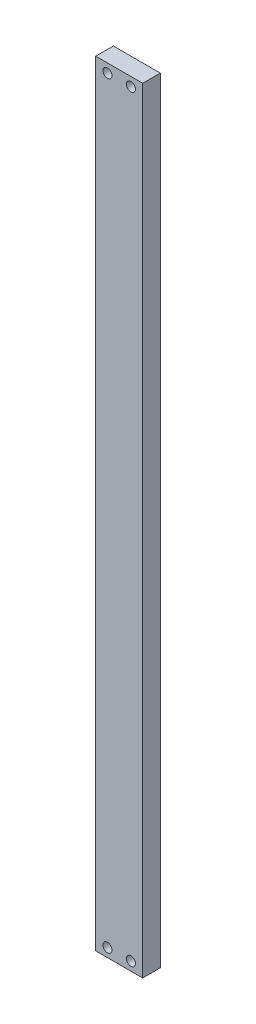
ISO-10303-21;
HEADER;
FILE_DESCRIPTION(('STEP AP214'),'2;1');
FILE_NAME('part.step','',(''),(''),'','','');
FILE_SCHEMA(('AUTOMOTIVE_DESIGN { 1 0 10303 214 1 1 1 1 }'));
ENDSEC;
DATA;
#1=APPLICATION_CONTEXT('core data for automotive mechanical design processes');
#2=APPLICATION_PROTOCOL_DEFINITION('international standard','automotive_design',2000,#1);
#3=PRODUCT_CONTEXT('',#1,'mechanical');
#4=PRODUCT('Part','Part','',(#3));
#5=PRODUCT_RELATED_PRODUCT_CATEGORY('part','',(#4));
#6=PRODUCT_DEFINITION_FORMATION('','',#4);
#7=PRODUCT_DEFINITION_CONTEXT('part definition',#1,'design');
#8=PRODUCT_DEFINITION('design','',#6,#7);
#9=PRODUCT_DEFINITION_SHAPE('','',#8);
#10=(LENGTH_UNIT() NAMED_UNIT(*) SI_UNIT(.MILLI.,.METRE.));
#11=(NAMED_UNIT(*) PLANE_ANGLE_UNIT() SI_UNIT($,.RADIAN.));
#12=(NAMED_UNIT(*) SI_UNIT($,.STERADIAN.) SOLID_ANGLE_UNIT());
#13=UNCERTAINTY_MEASURE_WITH_UNIT(LENGTH_MEASURE(1.E-05),#10,'distance_accuracy_value','');
#14=(GEOMETRIC_REPRESENTATION_CONTEXT(3) GLOBAL_UNCERTAINTY_ASSIGNED_CONTEXT((#13)) GLOBAL_UNIT_ASSIGNED_CONTEXT((#10,
#11,#12)) REPRESENTATION_CONTEXT('',''));
#15=CARTESIAN_POINT('',(0.,0.,0.));
#16=DIRECTION('',(0.,0.,1.));
#17=DIRECTION('',(1.,0.,0.));
#18=AXIS2_PLACEMENT_3D('',#15,#16,#17);
#19=CARTESIAN_POINT('',(-29.1923781698894,419.1,-9.525));
#20=DIRECTION('',(1.,0.,0.));
#21=DIRECTION('',(0.,0.,-1.));
#22=AXIS2_PLACEMENT_3D('',#19,#20,#21);
#23=PLANE('',#22);
#24=CARTESIAN_POINT('',(-29.1923781698894,393.7,-4.7625));
#25=DIRECTION('',(-1.,0.,0.));
#26=DIRECTION('',(0.,0.,1.));
#27=AXIS2_PLACEMENT_3D('',#24,#25,#26);
#28=CIRCLE('',#27,1.72719999999998);
#29=CARTESIAN_POINT('',(-29.1923781698894,393.7,-3.03530000000002));
#30=VERTEX_POINT('',#29);
#31=EDGE_CURVE('E114',#30,#30,#28,.T.);
#32=ORIENTED_EDGE('',*,*,#31,.F.);
#33=EDGE_LOOP('',(#32));
#34=FACE_BOUND('',#33,.T.);
#35=CARTESIAN_POINT('',(-29.1923781698894,320.04,-4.7625));
#36=DIRECTION('',(-1.,0.,0.));
#37=DIRECTION('',(0.,0.,1.));
#38=AXIS2_PLACEMENT_3D('',#35,#36,#37);
#39=CIRCLE('',#38,1.72719999999998);
#40=CARTESIAN_POINT('',(-29.1923781698894,320.04,-3.03530000000002));
#41=VERTEX_POINT('',#40);
#42=EDGE_CURVE('E113',#41,#41,#39,.T.);
#43=ORIENTED_EDGE('',*,*,#42,.F.);
#44=EDGE_LOOP('',(#43));
#45=FACE_BOUND('',#44,.T.);
#46=CARTESIAN_POINT('',(-29.1923781698894,246.38,-4.7625));
#47=DIRECTION('',(-1.,0.,0.));
#48=DIRECTION('',(0.,0.,1.));
#49=AXIS2_PLACEMENT_3D('',#46,#47,#48);
#50=CIRCLE('',#49,1.72719999999998);
#51=CARTESIAN_POINT('',(-29.1923781698894,246.38,-3.03530000000002));
#52=VERTEX_POINT('',#51);
#53=EDGE_CURVE('E124',#52,#52,#50,.T.);
#54=ORIENTED_EDGE('',*,*,#53,.F.);
#55=EDGE_LOOP('',(#54));
#56=FACE_BOUND('',#55,.T.);
#57=CARTESIAN_POINT('',(-29.1923781698894,172.72,-4.7625));
#58=DIRECTION('',(-1.,0.,0.));
#59=DIRECTION('',(0.,0.,1.));
#60=AXIS2_PLACEMENT_3D('',#57,#58,#59);
#61=CIRCLE('',#60,1.72719999999998);
#62=CARTESIAN_POINT('',(-29.1923781698894,172.72,-3.03530000000002));
#63=VERTEX_POINT('',#62);
#64=EDGE_CURVE('E130',#63,#63,#61,.T.);
#65=ORIENTED_EDGE('',*,*,#64,.F.);
#66=EDGE_LOOP('',(#65));
#67=FACE_BOUND('',#66,.T.);
#68=CARTESIAN_POINT('',(-29.1923781698894,99.06,-4.7625));
#69=DIRECTION('',(-1.,0.,0.));
#70=DIRECTION('',(0.,0.,1.));
#71=AXIS2_PLACEMENT_3D('',#68,#69,#70);
#72=CIRCLE('',#71,1.7272);
#73=CARTESIAN_POINT('',(-29.1923781698894,99.06,-3.0353));
#74=VERTEX_POINT('',#73);
#75=EDGE_CURVE('E136',#74,#74,#72,.T.);
#76=ORIENTED_EDGE('',*,*,#75,.F.);
#77=EDGE_LOOP('',(#76));
#78=FACE_BOUND('',#77,.T.);
#79=CARTESIAN_POINT('',(-29.1923781698894,25.4,-4.7625));
#80=DIRECTION('',(-1.,0.,0.));
#81=DIRECTION('',(0.,0.,1.));
#82=AXIS2_PLACEMENT_3D('',#79,#80,#81);
#83=CIRCLE('',#82,1.7272);
#84=CARTESIAN_POINT('',(-29.1923781698894,25.4,-3.0353));
#85=VERTEX_POINT('',#84);
#86=EDGE_CURVE('E142',#85,#85,#83,.T.);
#87=ORIENTED_EDGE('',*,*,#86,.F.);
#88=EDGE_LOOP('',(#87));
#89=FACE_BOUND('',#88,.T.);
#90=DIRECTION('',(0.,0.,1.));
#91=VECTOR('',#90,1.);
#92=CARTESIAN_POINT('',(-29.1923781698894,0.,-9.525));
#93=LINE('',#92,#91);
#94=CARTESIAN_POINT('',(-29.1923781698894,0.,-9.525));
#95=VERTEX_POINT('',#94);
#96=CARTESIAN_POINT('',(-29.1923781698894,0.,0.));
#97=VERTEX_POINT('',#96);
#98=EDGE_CURVE('E196',#95,#97,#93,.T.);
#99=ORIENTED_EDGE('',*,*,#98,.T.);
#100=DIRECTION('',(0.,-1.,0.));
#101=VECTOR('',#100,1.);
#102=CARTESIAN_POINT('',(-29.1923781698894,419.1,0.));
#103=LINE('',#102,#101);
#104=CARTESIAN_POINT('',(-29.1923781698894,419.1,0.));
#105=VERTEX_POINT('',#104);
#106=EDGE_CURVE('E11',#105,#97,#103,.T.);
#107=ORIENTED_EDGE('',*,*,#106,.F.);
#108=DIRECTION('',(0.,0.,1.));
#109=VECTOR('',#108,1.);
#110=CARTESIAN_POINT('',(-29.1923781698894,419.1,-9.525));
#111=LINE('',#110,#109);
#112=CARTESIAN_POINT('',(-29.1923781698894,419.1,-9.525));
#113=VERTEX_POINT('',#112);
#114=EDGE_CURVE('E197',#113,#105,#111,.T.);
#115=ORIENTED_EDGE('',*,*,#114,.F.);
#116=DIRECTION('',(0.,-1.,0.));
#117=VECTOR('',#116,1.);
#118=CARTESIAN_POINT('',(-29.1923781698894,419.1,-9.525));
#119=LINE('',#118,#117);
#120=EDGE_CURVE('E203',#113,#95,#119,.T.);
#121=ORIENTED_EDGE('',*,*,#120,.T.);
#122=EDGE_LOOP('',(#99,#107,#115,#121));
#123=FACE_BOUND('',#122,.T.);
#124=ADVANCED_FACE('F37',(#34,#45,#56,#67,#78,#89,#123),#23,.F.);
#125=CARTESIAN_POINT('',(-29.1923781698894,419.1,0.));
#126=DIRECTION('',(0.,0.,-1.));
#127=DIRECTION('',(-1.,0.,0.));
#128=AXIS2_PLACEMENT_3D('',#125,#126,#127);
#129=PLANE('',#128);
#130=CARTESIAN_POINT('',(-10.1423781698894,414.3375,0.));
#131=DIRECTION('',(0.,0.,-1.));
#132=DIRECTION('',(-1.,0.,0.));
#133=AXIS2_PLACEMENT_3D('',#130,#131,#132);
#134=CIRCLE('',#133,2.45745);
#135=CARTESIAN_POINT('',(-12.5998281698894,414.3375,0.));
#136=VERTEX_POINT('',#135);
#137=EDGE_CURVE('E157',#136,#136,#134,.T.);
#138=ORIENTED_EDGE('',*,*,#137,.T.);
#139=EDGE_LOOP('',(#138));
#140=FACE_BOUND('',#139,.T.);
#141=CARTESIAN_POINT('',(-22.8423781698894,414.3375,0.));
#142=DIRECTION('',(0.,0.,-1.));
#143=DIRECTION('',(-1.,0.,0.));
#144=AXIS2_PLACEMENT_3D('',#141,#142,#143);
#145=CIRCLE('',#144,2.45745);
#146=CARTESIAN_POINT('',(-25.2998281698894,414.3375,0.));
#147=VERTEX_POINT('',#146);
#148=EDGE_CURVE('E169',#147,#147,#145,.T.);
#149=ORIENTED_EDGE('',*,*,#148,.T.);
#150=EDGE_LOOP('',(#149));
#151=FACE_BOUND('',#150,.T.);
#152=CARTESIAN_POINT('',(-10.1423781698894,4.7625,0.));
#153=DIRECTION('',(0.,0.,-1.));
#154=DIRECTION('',(-1.,0.,0.));
#155=AXIS2_PLACEMENT_3D('',#152,#153,#154);
#156=CIRCLE('',#155,2.45745);
#157=CARTESIAN_POINT('',(-12.5998281698894,4.7625,0.));
#158=VERTEX_POINT('',#157);
#159=EDGE_CURVE('E181',#158,#158,#156,.T.);
#160=ORIENTED_EDGE('',*,*,#159,.T.);
#161=EDGE_LOOP('',(#160));
#162=FACE_BOUND('',#161,.T.);
#163=CARTESIAN_POINT('',(-22.8423781698894,4.7625,0.));
#164=DIRECTION('',(0.,0.,-1.));
#165=DIRECTION('',(-1.,0.,0.));
#166=AXIS2_PLACEMENT_3D('',#163,#164,#165);
#167=CIRCLE('',#166,2.45745);
#168=CARTESIAN_POINT('',(-25.2998281698894,4.7625,0.));
#169=VERTEX_POINT('',#168);
#170=EDGE_CURVE('E193',#169,#169,#167,.T.);
#171=ORIENTED_EDGE('',*,*,#170,.T.);
#172=EDGE_LOOP('',(#171));
#173=FACE_BOUND('',#172,.T.);
#174=DIRECTION('',(1.,0.,0.));
#175=VECTOR('',#174,1.);
#176=CARTESIAN_POINT('',(-29.1923781698894,0.,0.));
#177=LINE('',#176,#175);
#178=CARTESIAN_POINT('',(-3.7923781698894,0.,0.));
#179=VERTEX_POINT('',#178);
#180=EDGE_CURVE('E206',#97,#179,#177,.T.);
#181=ORIENTED_EDGE('',*,*,#180,.T.);
#182=DIRECTION('',(0.,-1.,0.));
#183=VECTOR('',#182,1.);
#184=CARTESIAN_POINT('',(-3.7923781698894,419.1,0.));
#185=LINE('',#184,#183);
#186=CARTESIAN_POINT('',(-3.7923781698894,419.1,0.));
#187=VERTEX_POINT('',#186);
#188=EDGE_CURVE('E45',#187,#179,#185,.T.);
#189=ORIENTED_EDGE('',*,*,#188,.F.);
#190=DIRECTION('',(1.,0.,0.));
#191=VECTOR('',#190,1.);
#192=CARTESIAN_POINT('',(-29.1923781698894,419.1,0.));
#193=LINE('',#192,#191);
#194=EDGE_CURVE('E84',#105,#187,#193,.T.);
#195=ORIENTED_EDGE('',*,*,#194,.F.);
#196=ORIENTED_EDGE('',*,*,#106,.T.);
#197=EDGE_LOOP('',(#181,#189,#195,#196));
#198=FACE_BOUND('',#197,.T.);
#199=ADVANCED_FACE('F230',(#140,#151,#162,#173,#198),#129,.F.);
#200=CARTESIAN_POINT('',(-3.7923781698894,419.1,-9.525));
#201=DIRECTION('',(-1.,0.,0.));
#202=DIRECTION('',(0.,0.,1.));
#203=AXIS2_PLACEMENT_3D('',#200,#201,#202);
#204=PLANE('',#203);
#205=DIRECTION('',(0.,0.,-1.));
#206=VECTOR('',#205,1.);
#207=CARTESIAN_POINT('',(-3.7923781698894,0.,-9.525));
#208=LINE('',#207,#206);
#209=CARTESIAN_POINT('',(-3.7923781698894,0.,-9.525));
#210=VERTEX_POINT('',#209);
#211=EDGE_CURVE('E71',#179,#210,#208,.T.);
#212=ORIENTED_EDGE('',*,*,#211,.T.);
#213=DIRECTION('',(0.,-1.,0.));
#214=VECTOR('',#213,1.);
#215=CARTESIAN_POINT('',(-3.7923781698894,419.1,-9.525));
#216=LINE('',#215,#214);
#217=CARTESIAN_POINT('',(-3.7923781698894,419.1,-9.525));
#218=VERTEX_POINT('',#217);
#219=EDGE_CURVE('E211',#218,#210,#216,.T.);
#220=ORIENTED_EDGE('',*,*,#219,.F.);
#221=DIRECTION('',(0.,0.,-1.));
#222=VECTOR('',#221,1.);
#223=CARTESIAN_POINT('',(-3.7923781698894,419.1,-9.525));
#224=LINE('',#223,#222);
#225=EDGE_CURVE('E200',#187,#218,#224,.T.);
#226=ORIENTED_EDGE('',*,*,#225,.F.);
#227=ORIENTED_EDGE('',*,*,#188,.T.);
#228=EDGE_LOOP('',(#212,#220,#226,#227));
#229=FACE_BOUND('',#228,.T.);
#230=ADVANCED_FACE('F213',(#229),#204,.F.);
#231=CARTESIAN_POINT('',(-29.1923781698894,419.1,-9.525));
#232=DIRECTION('',(0.,0.,1.));
#233=DIRECTION('',(1.,0.,0.));
#234=AXIS2_PLACEMENT_3D('',#231,#232,#233);
#235=PLANE('',#234);
#236=CARTESIAN_POINT('',(-10.1423781698894,414.3375,-9.525));
#237=DIRECTION('',(0.,0.,-1.));
#238=DIRECTION('',(-1.,0.,0.));
#239=AXIS2_PLACEMENT_3D('',#236,#237,#238);
#240=CIRCLE('',#239,3.96875);
#241=CARTESIAN_POINT('',(-14.1111281698894,414.3375,-9.525));
#242=VERTEX_POINT('',#241);
#243=EDGE_CURVE('E148',#242,#242,#240,.T.);
#244=ORIENTED_EDGE('',*,*,#243,.F.);
#245=EDGE_LOOP('',(#244));
#246=FACE_BOUND('',#245,.T.);
#247=CARTESIAN_POINT('',(-22.8423781698894,414.3375,-9.525));
#248=DIRECTION('',(0.,0.,-1.));
#249=DIRECTION('',(-1.,0.,0.));
#250=AXIS2_PLACEMENT_3D('',#247,#248,#249);
#251=CIRCLE('',#250,3.96875);
#252=CARTESIAN_POINT('',(-26.8111281698894,414.3375,-9.525));
#253=VERTEX_POINT('',#252);
#254=EDGE_CURVE('E160',#253,#253,#251,.T.);
#255=ORIENTED_EDGE('',*,*,#254,.F.);
#256=EDGE_LOOP('',(#255));
#257=FACE_BOUND('',#256,.T.);
#258=CARTESIAN_POINT('',(-10.1423781698894,4.7625,-9.525));
#259=DIRECTION('',(0.,0.,-1.));
#260=DIRECTION('',(-1.,0.,0.));
#261=AXIS2_PLACEMENT_3D('',#258,#259,#260);
#262=CIRCLE('',#261,3.96875);
#263=CARTESIAN_POINT('',(-14.1111281698894,4.7625,-9.525));
#264=VERTEX_POINT('',#263);
#265=EDGE_CURVE('E172',#264,#264,#262,.T.);
#266=ORIENTED_EDGE('',*,*,#265,.F.);
#267=EDGE_LOOP('',(#266));
#268=FACE_BOUND('',#267,.T.);
#269=CARTESIAN_POINT('',(-22.8423781698894,4.7625,-9.525));
#270=DIRECTION('',(0.,0.,-1.));
#271=DIRECTION('',(-1.,0.,0.));
#272=AXIS2_PLACEMENT_3D('',#269,#270,#271);
#273=CIRCLE('',#272,3.96875);
#274=CARTESIAN_POINT('',(-26.8111281698894,4.7625,-9.525));
#275=VERTEX_POINT('',#274);
#276=EDGE_CURVE('E184',#275,#275,#273,.T.);
#277=ORIENTED_EDGE('',*,*,#276,.F.);
#278=EDGE_LOOP('',(#277));
#279=FACE_BOUND('',#278,.T.);
#280=DIRECTION('',(-1.,0.,0.));
#281=VECTOR('',#280,1.);
#282=CARTESIAN_POINT('',(-29.1923781698894,0.,-9.525));
#283=LINE('',#282,#281);
#284=EDGE_CURVE('E77',#210,#95,#283,.T.);
#285=ORIENTED_EDGE('',*,*,#284,.T.);
#286=ORIENTED_EDGE('',*,*,#120,.F.);
#287=DIRECTION('',(-1.,0.,0.));
#288=VECTOR('',#287,1.);
#289=CARTESIAN_POINT('',(-29.1923781698894,419.1,-9.525));
#290=LINE('',#289,#288);
#291=EDGE_CURVE('E53',#218,#113,#290,.T.);
#292=ORIENTED_EDGE('',*,*,#291,.F.);
#293=ORIENTED_EDGE('',*,*,#219,.T.);
#294=EDGE_LOOP('',(#285,#286,#292,#293));
#295=FACE_BOUND('',#294,.T.);
#296=ADVANCED_FACE('F220',(#246,#257,#268,#279,#295),#235,.F.);
#297=CARTESIAN_POINT('',(0.,419.1,0.));
#298=DIRECTION('',(0.,1.,0.));
#299=DIRECTION('',(0.,0.,1.));
#300=AXIS2_PLACEMENT_3D('',#297,#298,#299);
#301=PLANE('',#300);
#302=ORIENTED_EDGE('',*,*,#114,.T.);
#303=ORIENTED_EDGE('',*,*,#194,.T.);
#304=ORIENTED_EDGE('',*,*,#225,.T.);
#305=ORIENTED_EDGE('',*,*,#291,.T.);
#306=EDGE_LOOP('',(#302,#303,#304,#305));
#307=FACE_BOUND('',#306,.T.);
#308=ADVANCED_FACE('F222',(#307),#301,.T.);
#309=CARTESIAN_POINT('',(0.,0.,0.));
#310=DIRECTION('',(0.,1.,0.));
#311=DIRECTION('',(0.,0.,1.));
#312=AXIS2_PLACEMENT_3D('',#309,#310,#311);
#313=PLANE('',#312);
#314=ORIENTED_EDGE('',*,*,#98,.F.);
#315=ORIENTED_EDGE('',*,*,#284,.F.);
#316=ORIENTED_EDGE('',*,*,#211,.F.);
#317=ORIENTED_EDGE('',*,*,#180,.F.);
#318=EDGE_LOOP('',(#314,#315,#316,#317));
#319=FACE_BOUND('',#318,.T.);
#320=ADVANCED_FACE('F216',(#319),#313,.F.);
#321=CARTESIAN_POINT('',(-22.8423781698894,4.7625,-9.525));
#322=DIRECTION('',(0.,0.,-1.));
#323=DIRECTION('',(-1.,0.,0.));
#324=AXIS2_PLACEMENT_3D('',#321,#322,#323);
#325=CYLINDRICAL_SURFACE('',#324,2.45745000000001);
#326=ORIENTED_EDGE('',*,*,#170,.F.);
#327=EDGE_LOOP('',(#326));
#328=FACE_BOUND('',#327,.T.);
#329=CARTESIAN_POINT('',(-22.8423781698894,4.7625,-5.3594));
#330=DIRECTION('',(0.,0.,-1.));
#331=DIRECTION('',(-1.,0.,0.));
#332=AXIS2_PLACEMENT_3D('',#329,#330,#331);
#333=CIRCLE('',#332,2.45745000000001);
#334=CARTESIAN_POINT('',(-25.2998281698894,4.7625,-5.3594));
#335=VERTEX_POINT('',#334);
#336=EDGE_CURVE('E190',#335,#335,#333,.T.);
#337=ORIENTED_EDGE('',*,*,#336,.T.);
#338=EDGE_LOOP('',(#337));
#339=FACE_BOUND('',#338,.T.);
#340=ADVANCED_FACE('F314',(#328,#339),#325,.F.);
#341=CARTESIAN_POINT('',(-20.3849281698894,4.7625,-5.3594));
#342=DIRECTION('',(0.,0.,1.));
#343=DIRECTION('',(1.,0.,0.));
#344=AXIS2_PLACEMENT_3D('',#341,#342,#343);
#345=PLANE('',#344);
#346=ORIENTED_EDGE('',*,*,#336,.F.);
#347=EDGE_LOOP('',(#346));
#348=FACE_BOUND('',#347,.T.);
#349=CARTESIAN_POINT('',(-22.8423781698894,4.7625,-5.3594));
#350=DIRECTION('',(0.,0.,-1.));
#351=DIRECTION('',(-1.,0.,0.));
#352=AXIS2_PLACEMENT_3D('',#349,#350,#351);
#353=CIRCLE('',#352,3.96875);
#354=CARTESIAN_POINT('',(-26.8111281698894,4.7625,-5.3594));
#355=VERTEX_POINT('',#354);
#356=EDGE_CURVE('E187',#355,#355,#353,.T.);
#357=ORIENTED_EDGE('',*,*,#356,.T.);
#358=EDGE_LOOP('',(#357));
#359=FACE_BOUND('',#358,.T.);
#360=ADVANCED_FACE('F310',(#348,#359),#345,.F.);
#361=CARTESIAN_POINT('',(-22.8423781698894,4.7625,-9.525));
#362=DIRECTION('',(0.,0.,-1.));
#363=DIRECTION('',(-1.,0.,0.));
#364=AXIS2_PLACEMENT_3D('',#361,#362,#363);
#365=CYLINDRICAL_SURFACE('',#364,3.96875);
#366=ORIENTED_EDGE('',*,*,#356,.F.);
#367=EDGE_LOOP('',(#366));
#368=FACE_BOUND('',#367,.T.);
#369=ORIENTED_EDGE('',*,*,#276,.T.);
#370=EDGE_LOOP('',(#369));
#371=FACE_BOUND('',#370,.T.);
#372=ADVANCED_FACE('F306',(#368,#371),#365,.F.);
#373=CARTESIAN_POINT('',(-10.1423781698894,4.7625,-9.525));
#374=DIRECTION('',(0.,0.,-1.));
#375=DIRECTION('',(-1.,0.,0.));
#376=AXIS2_PLACEMENT_3D('',#373,#374,#375);
#377=CYLINDRICAL_SURFACE('',#376,2.45745000000001);
#378=ORIENTED_EDGE('',*,*,#159,.F.);
#379=EDGE_LOOP('',(#378));
#380=FACE_BOUND('',#379,.T.);
#381=CARTESIAN_POINT('',(-10.1423781698894,4.7625,-5.3594));
#382=DIRECTION('',(0.,0.,-1.));
#383=DIRECTION('',(-1.,0.,0.));
#384=AXIS2_PLACEMENT_3D('',#381,#382,#383);
#385=CIRCLE('',#384,2.45745000000001);
#386=CARTESIAN_POINT('',(-12.5998281698894,4.7625,-5.3594));
#387=VERTEX_POINT('',#386);
#388=EDGE_CURVE('E178',#387,#387,#385,.T.);
#389=ORIENTED_EDGE('',*,*,#388,.T.);
#390=EDGE_LOOP('',(#389));
#391=FACE_BOUND('',#390,.T.);
#392=ADVANCED_FACE('F302',(#380,#391),#377,.F.);
#393=CARTESIAN_POINT('',(-7.68492816988939,4.7625,-5.3594));
#394=DIRECTION('',(0.,0.,1.));
#395=DIRECTION('',(1.,0.,0.));
#396=AXIS2_PLACEMENT_3D('',#393,#394,#395);
#397=PLANE('',#396);
#398=ORIENTED_EDGE('',*,*,#388,.F.);
#399=EDGE_LOOP('',(#398));
#400=FACE_BOUND('',#399,.T.);
#401=CARTESIAN_POINT('',(-10.1423781698894,4.7625,-5.3594));
#402=DIRECTION('',(0.,0.,-1.));
#403=DIRECTION('',(-1.,0.,0.));
#404=AXIS2_PLACEMENT_3D('',#401,#402,#403);
#405=CIRCLE('',#404,3.96875);
#406=CARTESIAN_POINT('',(-14.1111281698894,4.7625,-5.3594));
#407=VERTEX_POINT('',#406);
#408=EDGE_CURVE('E175',#407,#407,#405,.T.);
#409=ORIENTED_EDGE('',*,*,#408,.T.);
#410=EDGE_LOOP('',(#409));
#411=FACE_BOUND('',#410,.T.);
#412=ADVANCED_FACE('F298',(#400,#411),#397,.F.);
#413=CARTESIAN_POINT('',(-10.1423781698894,4.7625,-9.525));
#414=DIRECTION('',(0.,0.,-1.));
#415=DIRECTION('',(-1.,0.,0.));
#416=AXIS2_PLACEMENT_3D('',#413,#414,#415);
#417=CYLINDRICAL_SURFACE('',#416,3.96875);
#418=ORIENTED_EDGE('',*,*,#408,.F.);
#419=EDGE_LOOP('',(#418));
#420=FACE_BOUND('',#419,.T.);
#421=ORIENTED_EDGE('',*,*,#265,.T.);
#422=EDGE_LOOP('',(#421));
#423=FACE_BOUND('',#422,.T.);
#424=ADVANCED_FACE('F294',(#420,#423),#417,.F.);
#425=CARTESIAN_POINT('',(-22.8423781698894,414.3375,-9.525));
#426=DIRECTION('',(0.,0.,-1.));
#427=DIRECTION('',(-1.,0.,0.));
#428=AXIS2_PLACEMENT_3D('',#425,#426,#427);
#429=CYLINDRICAL_SURFACE('',#428,2.45745000000001);
#430=ORIENTED_EDGE('',*,*,#148,.F.);
#431=EDGE_LOOP('',(#430));
#432=FACE_BOUND('',#431,.T.);
#433=CARTESIAN_POINT('',(-22.8423781698894,414.3375,-5.3594));
#434=DIRECTION('',(0.,0.,-1.));
#435=DIRECTION('',(-1.,0.,0.));
#436=AXIS2_PLACEMENT_3D('',#433,#434,#435);
#437=CIRCLE('',#436,2.45745000000001);
#438=CARTESIAN_POINT('',(-25.2998281698894,414.3375,-5.3594));
#439=VERTEX_POINT('',#438);
#440=EDGE_CURVE('E166',#439,#439,#437,.T.);
#441=ORIENTED_EDGE('',*,*,#440,.T.);
#442=EDGE_LOOP('',(#441));
#443=FACE_BOUND('',#442,.T.);
#444=ADVANCED_FACE('F290',(#432,#443),#429,.F.);
#445=CARTESIAN_POINT('',(-20.3849281698894,414.3375,-5.3594));
#446=DIRECTION('',(0.,0.,1.));
#447=DIRECTION('',(1.,0.,0.));
#448=AXIS2_PLACEMENT_3D('',#445,#446,#447);
#449=PLANE('',#448);
#450=ORIENTED_EDGE('',*,*,#440,.F.);
#451=EDGE_LOOP('',(#450));
#452=FACE_BOUND('',#451,.T.);
#453=CARTESIAN_POINT('',(-22.8423781698894,414.3375,-5.3594));
#454=DIRECTION('',(0.,0.,-1.));
#455=DIRECTION('',(-1.,0.,0.));
#456=AXIS2_PLACEMENT_3D('',#453,#454,#455);
#457=CIRCLE('',#456,3.96875);
#458=CARTESIAN_POINT('',(-26.8111281698894,414.3375,-5.3594));
#459=VERTEX_POINT('',#458);
#460=EDGE_CURVE('E163',#459,#459,#457,.T.);
#461=ORIENTED_EDGE('',*,*,#460,.T.);
#462=EDGE_LOOP('',(#461));
#463=FACE_BOUND('',#462,.T.);
#464=ADVANCED_FACE('F286',(#452,#463),#449,.F.);
#465=CARTESIAN_POINT('',(-22.8423781698894,414.3375,-9.525));
#466=DIRECTION('',(0.,0.,-1.));
#467=DIRECTION('',(-1.,0.,0.));
#468=AXIS2_PLACEMENT_3D('',#465,#466,#467);
#469=CYLINDRICAL_SURFACE('',#468,3.96875);
#470=ORIENTED_EDGE('',*,*,#460,.F.);
#471=EDGE_LOOP('',(#470));
#472=FACE_BOUND('',#471,.T.);
#473=ORIENTED_EDGE('',*,*,#254,.T.);
#474=EDGE_LOOP('',(#473));
#475=FACE_BOUND('',#474,.T.);
#476=ADVANCED_FACE('F282',(#472,#475),#469,.F.);
#477=CARTESIAN_POINT('',(-10.1423781698894,414.3375,-9.525));
#478=DIRECTION('',(0.,0.,-1.));
#479=DIRECTION('',(-1.,0.,0.));
#480=AXIS2_PLACEMENT_3D('',#477,#478,#479);
#481=CYLINDRICAL_SURFACE('',#480,2.45745000000001);
#482=ORIENTED_EDGE('',*,*,#137,.F.);
#483=EDGE_LOOP('',(#482));
#484=FACE_BOUND('',#483,.T.);
#485=CARTESIAN_POINT('',(-10.1423781698894,414.3375,-5.3594));
#486=DIRECTION('',(0.,0.,-1.));
#487=DIRECTION('',(-1.,0.,0.));
#488=AXIS2_PLACEMENT_3D('',#485,#486,#487);
#489=CIRCLE('',#488,2.45745000000001);
#490=CARTESIAN_POINT('',(-12.5998281698894,414.3375,-5.3594));
#491=VERTEX_POINT('',#490);
#492=EDGE_CURVE('E154',#491,#491,#489,.T.);
#493=ORIENTED_EDGE('',*,*,#492,.T.);
#494=EDGE_LOOP('',(#493));
#495=FACE_BOUND('',#494,.T.);
#496=ADVANCED_FACE('F278',(#484,#495),#481,.F.);
#497=CARTESIAN_POINT('',(-7.68492816988939,414.3375,-5.3594));
#498=DIRECTION('',(0.,0.,1.));
#499=DIRECTION('',(1.,0.,0.));
#500=AXIS2_PLACEMENT_3D('',#497,#498,#499);
#501=PLANE('',#500);
#502=ORIENTED_EDGE('',*,*,#492,.F.);
#503=EDGE_LOOP('',(#502));
#504=FACE_BOUND('',#503,.T.);
#505=CARTESIAN_POINT('',(-10.1423781698894,414.3375,-5.3594));
#506=DIRECTION('',(0.,0.,-1.));
#507=DIRECTION('',(-1.,0.,0.));
#508=AXIS2_PLACEMENT_3D('',#505,#506,#507);
#509=CIRCLE('',#508,3.96875);
#510=CARTESIAN_POINT('',(-14.1111281698894,414.3375,-5.3594));
#511=VERTEX_POINT('',#510);
#512=EDGE_CURVE('E151',#511,#511,#509,.T.);
#513=ORIENTED_EDGE('',*,*,#512,.T.);
#514=EDGE_LOOP('',(#513));
#515=FACE_BOUND('',#514,.T.);
#516=ADVANCED_FACE('F274',(#504,#515),#501,.F.);
#517=CARTESIAN_POINT('',(-10.1423781698894,414.3375,-9.525));
#518=DIRECTION('',(0.,0.,-1.));
#519=DIRECTION('',(-1.,0.,0.));
#520=AXIS2_PLACEMENT_3D('',#517,#518,#519);
#521=CYLINDRICAL_SURFACE('',#520,3.96875);
#522=ORIENTED_EDGE('',*,*,#512,.F.);
#523=EDGE_LOOP('',(#522));
#524=FACE_BOUND('',#523,.T.);
#525=ORIENTED_EDGE('',*,*,#243,.T.);
#526=EDGE_LOOP('',(#525));
#527=FACE_BOUND('',#526,.T.);
#528=ADVANCED_FACE('F266',(#524,#527),#521,.F.);
#529=CARTESIAN_POINT('',(-13.1903781698894,25.4,-4.7625));
#530=DIRECTION('',(-1.,0.,0.));
#531=DIRECTION('',(0.,0.,1.));
#532=AXIS2_PLACEMENT_3D('',#529,#530,#531);
#533=CONICAL_SURFACE('',#532,1.72719999999999,1.02974425867665);
#534=CARTESIAN_POINT('',(-12.152571708705,25.4,-4.7625));
#535=VERTEX_POINT('',#534);
#536=VERTEX_LOOP('',#535);
#537=FACE_BOUND('',#536,.T.);
#538=CARTESIAN_POINT('',(-13.1903781698894,25.4,-4.7625));
#539=DIRECTION('',(-1.,0.,0.));
#540=DIRECTION('',(0.,0.,1.));
#541=AXIS2_PLACEMENT_3D('',#538,#539,#540);
#542=CIRCLE('',#541,1.72719999999999);
#543=CARTESIAN_POINT('',(-13.1903781698894,25.4,-3.03530000000001));
#544=VERTEX_POINT('',#543);
#545=EDGE_CURVE('E145',#544,#544,#542,.T.);
#546=ORIENTED_EDGE('',*,*,#545,.T.);
#547=EDGE_LOOP('',(#546));
#548=FACE_BOUND('',#547,.T.);
#549=ADVANCED_FACE('F256',(#537,#548),#533,.F.);
#550=CARTESIAN_POINT('',(-29.1923781698894,25.4,-4.7625));
#551=DIRECTION('',(-1.,0.,0.));
#552=DIRECTION('',(0.,0.,1.));
#553=AXIS2_PLACEMENT_3D('',#550,#551,#552);
#554=CYLINDRICAL_SURFACE('',#553,1.7272);
#555=ORIENTED_EDGE('',*,*,#545,.F.);
#556=EDGE_LOOP('',(#555));
#557=FACE_BOUND('',#556,.T.);
#558=ORIENTED_EDGE('',*,*,#86,.T.);
#559=EDGE_LOOP('',(#558));
#560=FACE_BOUND('',#559,.T.);
#561=ADVANCED_FACE('F253',(#557,#560),#554,.F.);
#562=CARTESIAN_POINT('',(-13.1903781698894,99.06,-4.7625));
#563=DIRECTION('',(-1.,0.,0.));
#564=DIRECTION('',(0.,0.,1.));
#565=AXIS2_PLACEMENT_3D('',#562,#563,#564);
#566=CONICAL_SURFACE('',#565,1.7272,1.02974425867665);
#567=CARTESIAN_POINT('',(-12.152571708705,99.06,-4.7625));
#568=VERTEX_POINT('',#567);
#569=VERTEX_LOOP('',#568);
#570=FACE_BOUND('',#569,.T.);
#571=CARTESIAN_POINT('',(-13.1903781698894,99.06,-4.7625));
#572=DIRECTION('',(-1.,0.,0.));
#573=DIRECTION('',(0.,0.,1.));
#574=AXIS2_PLACEMENT_3D('',#571,#572,#573);
#575=CIRCLE('',#574,1.7272);
#576=CARTESIAN_POINT('',(-13.1903781698894,99.06,-3.0353));
#577=VERTEX_POINT('',#576);
#578=EDGE_CURVE('E139',#577,#577,#575,.T.);
#579=ORIENTED_EDGE('',*,*,#578,.T.);
#580=EDGE_LOOP('',(#579));
#581=FACE_BOUND('',#580,.T.);
#582=ADVANCED_FACE('F255',(#570,#581),#566,.F.);
#583=CARTESIAN_POINT('',(-29.1923781698894,99.06,-4.7625));
#584=DIRECTION('',(-1.,0.,0.));
#585=DIRECTION('',(0.,0.,1.));
#586=AXIS2_PLACEMENT_3D('',#583,#584,#585);
#587=CYLINDRICAL_SURFACE('',#586,1.7272);
#588=ORIENTED_EDGE('',*,*,#578,.F.);
#589=EDGE_LOOP('',(#588));
#590=FACE_BOUND('',#589,.T.);
#591=ORIENTED_EDGE('',*,*,#75,.T.);
#592=EDGE_LOOP('',(#591));
#593=FACE_BOUND('',#592,.T.);
#594=ADVANCED_FACE('F263',(#590,#593),#587,.F.);
#595=CARTESIAN_POINT('',(-13.1903781698894,172.72,-4.7625));
#596=DIRECTION('',(-1.,0.,0.));
#597=DIRECTION('',(0.,0.,1.));
#598=AXIS2_PLACEMENT_3D('',#595,#596,#597);
#599=CONICAL_SURFACE('',#598,1.72719999999998,1.02974425867665);
#600=CARTESIAN_POINT('',(-12.152571708705,172.72,-4.7625));
#601=VERTEX_POINT('',#600);
#602=VERTEX_LOOP('',#601);
#603=FACE_BOUND('',#602,.T.);
#604=CARTESIAN_POINT('',(-13.1903781698894,172.72,-4.7625));
#605=DIRECTION('',(-1.,0.,0.));
#606=DIRECTION('',(0.,0.,1.));
#607=AXIS2_PLACEMENT_3D('',#604,#605,#606);
#608=CIRCLE('',#607,1.72719999999998);
#609=CARTESIAN_POINT('',(-13.1903781698894,172.72,-3.03530000000002));
#610=VERTEX_POINT('',#609);
#611=EDGE_CURVE('E133',#610,#610,#608,.T.);
#612=ORIENTED_EDGE('',*,*,#611,.T.);
#613=EDGE_LOOP('',(#612));
#614=FACE_BOUND('',#613,.T.);
#615=ADVANCED_FACE('F401',(#603,#614),#599,.F.);
#616=CARTESIAN_POINT('',(-29.1923781698894,172.72,-4.7625));
#617=DIRECTION('',(-1.,0.,0.));
#618=DIRECTION('',(0.,0.,1.));
#619=AXIS2_PLACEMENT_3D('',#616,#617,#618);
#620=CYLINDRICAL_SURFACE('',#619,1.72719999999998);
#621=ORIENTED_EDGE('',*,*,#611,.F.);
#622=EDGE_LOOP('',(#621));
#623=FACE_BOUND('',#622,.T.);
#624=ORIENTED_EDGE('',*,*,#64,.T.);
#625=EDGE_LOOP('',(#624));
#626=FACE_BOUND('',#625,.T.);
#627=ADVANCED_FACE('F412',(#623,#626),#620,.F.);
#628=CARTESIAN_POINT('',(-13.1903781698894,246.38,-4.7625));
#629=DIRECTION('',(-1.,0.,0.));
#630=DIRECTION('',(0.,0.,1.));
#631=AXIS2_PLACEMENT_3D('',#628,#629,#630);
#632=CONICAL_SURFACE('',#631,1.72719999999998,1.02974425867665);
#633=CARTESIAN_POINT('',(-12.152571708705,246.38,-4.7625));
#634=VERTEX_POINT('',#633);
#635=VERTEX_LOOP('',#634);
#636=FACE_BOUND('',#635,.T.);
#637=CARTESIAN_POINT('',(-13.1903781698894,246.38,-4.7625));
#638=DIRECTION('',(-1.,0.,0.));
#639=DIRECTION('',(0.,0.,1.));
#640=AXIS2_PLACEMENT_3D('',#637,#638,#639);
#641=CIRCLE('',#640,1.72719999999998);
#642=CARTESIAN_POINT('',(-13.1903781698894,246.38,-3.03530000000002));
#643=VERTEX_POINT('',#642);
#644=EDGE_CURVE('E127',#643,#643,#641,.T.);
#645=ORIENTED_EDGE('',*,*,#644,.T.);
#646=EDGE_LOOP('',(#645));
#647=FACE_BOUND('',#646,.T.);
#648=ADVANCED_FACE('F422',(#636,#647),#632,.F.);
#649=CARTESIAN_POINT('',(-29.1923781698894,246.38,-4.7625));
#650=DIRECTION('',(-1.,0.,0.));
#651=DIRECTION('',(0.,0.,1.));
#652=AXIS2_PLACEMENT_3D('',#649,#650,#651);
#653=CYLINDRICAL_SURFACE('',#652,1.72719999999998);
#654=ORIENTED_EDGE('',*,*,#644,.F.);
#655=EDGE_LOOP('',(#654));
#656=FACE_BOUND('',#655,.T.);
#657=ORIENTED_EDGE('',*,*,#53,.T.);
#658=EDGE_LOOP('',(#657));
#659=FACE_BOUND('',#658,.T.);
#660=ADVANCED_FACE('F434',(#656,#659),#653,.F.);
#661=CARTESIAN_POINT('',(-13.1903781698894,320.04,-4.7625));
#662=DIRECTION('',(-1.,0.,0.));
#663=DIRECTION('',(0.,0.,1.));
#664=AXIS2_PLACEMENT_3D('',#661,#662,#663);
#665=CONICAL_SURFACE('',#664,1.72719999999998,1.02974425867665);
#666=CARTESIAN_POINT('',(-12.152571708705,320.04,-4.7625));
#667=VERTEX_POINT('',#666);
#668=VERTEX_LOOP('',#667);
#669=FACE_BOUND('',#668,.T.);
#670=CARTESIAN_POINT('',(-13.1903781698894,320.04,-4.7625));
#671=DIRECTION('',(-1.,0.,0.));
#672=DIRECTION('',(0.,0.,1.));
#673=AXIS2_PLACEMENT_3D('',#670,#671,#672);
#674=CIRCLE('',#673,1.72719999999998);
#675=CARTESIAN_POINT('',(-13.1903781698894,320.04,-3.03530000000002));
#676=VERTEX_POINT('',#675);
#677=EDGE_CURVE('E117',#676,#676,#674,.T.);
#678=ORIENTED_EDGE('',*,*,#677,.T.);
#679=EDGE_LOOP('',(#678));
#680=FACE_BOUND('',#679,.T.);
#681=ADVANCED_FACE('F444',(#669,#680),#665,.F.);
#682=CARTESIAN_POINT('',(-29.1923781698894,320.04,-4.7625));
#683=DIRECTION('',(-1.,0.,0.));
#684=DIRECTION('',(0.,0.,1.));
#685=AXIS2_PLACEMENT_3D('',#682,#683,#684);
#686=CYLINDRICAL_SURFACE('',#685,1.72719999999998);
#687=ORIENTED_EDGE('',*,*,#677,.F.);
#688=EDGE_LOOP('',(#687));
#689=FACE_BOUND('',#688,.T.);
#690=ORIENTED_EDGE('',*,*,#42,.T.);
#691=EDGE_LOOP('',(#690));
#692=FACE_BOUND('',#691,.T.);
#693=ADVANCED_FACE('F107',(#689,#692),#686,.F.);
#694=CARTESIAN_POINT('',(-13.1903781698894,393.7,-4.7625));
#695=DIRECTION('',(-1.,0.,0.));
#696=DIRECTION('',(0.,0.,1.));
#697=AXIS2_PLACEMENT_3D('',#694,#695,#696);
#698=CONICAL_SURFACE('',#697,1.72719999999998,1.02974425867665);
#699=CARTESIAN_POINT('',(-12.152571708705,393.7,-4.7625));
#700=VERTEX_POINT('',#699);
#701=VERTEX_LOOP('',#700);
#702=FACE_BOUND('',#701,.T.);
#703=CARTESIAN_POINT('',(-13.1903781698894,393.7,-4.7625));
#704=DIRECTION('',(-1.,0.,0.));
#705=DIRECTION('',(0.,0.,1.));
#706=AXIS2_PLACEMENT_3D('',#703,#704,#705);
#707=CIRCLE('',#706,1.72719999999998);
#708=CARTESIAN_POINT('',(-13.1903781698894,393.7,-3.03530000000002));
#709=VERTEX_POINT('',#708);
#710=EDGE_CURVE('E111',#709,#709,#707,.T.);
#711=ORIENTED_EDGE('',*,*,#710,.T.);
#712=EDGE_LOOP('',(#711));
#713=FACE_BOUND('',#712,.T.);
#714=ADVANCED_FACE('F103',(#702,#713),#698,.F.);
#715=CARTESIAN_POINT('',(-29.1923781698894,393.7,-4.7625));
#716=DIRECTION('',(-1.,0.,0.));
#717=DIRECTION('',(0.,0.,1.));
#718=AXIS2_PLACEMENT_3D('',#715,#716,#717);
#719=CYLINDRICAL_SURFACE('',#718,1.72719999999998);
#720=ORIENTED_EDGE('',*,*,#710,.F.);
#721=EDGE_LOOP('',(#720));
#722=FACE_BOUND('',#721,.T.);
#723=ORIENTED_EDGE('',*,*,#31,.T.);
#724=EDGE_LOOP('',(#723));
#725=FACE_BOUND('',#724,.T.);
#726=ADVANCED_FACE('F106',(#722,#725),#719,.F.);
#727=CLOSED_SHELL('',(#124,#199,#230,#296,#308,#320,#340,#360,#372,#392,#412,#424,#444,#464,
#476,#496,#516,#528,#549,#561,#582,#594,#615,#627,#648,#660,#681,#693,#714,#726));
#728=MANIFOLD_SOLID_BREP('B2',#727);
#729=ADVANCED_BREP_SHAPE_REPRESENTATION('',(#18,#728),#14);
#730=SHAPE_DEFINITION_REPRESENTATION(#9,#729);
ENDSEC;
END-ISO-10303-21;
